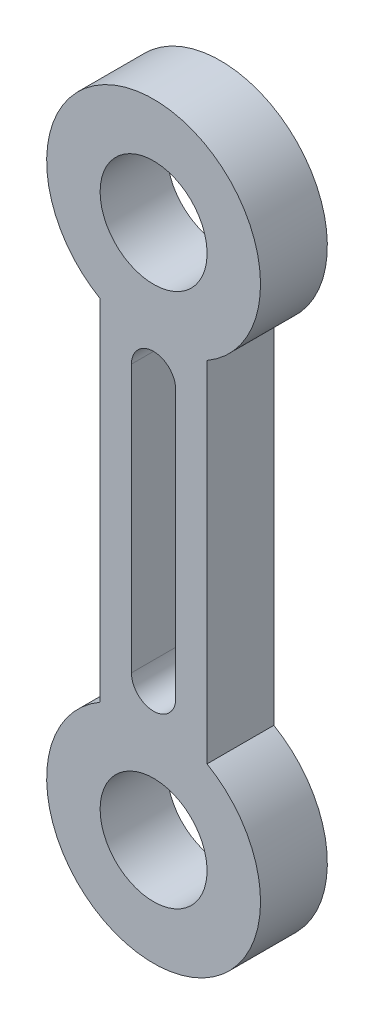
ISO-10303-21;
HEADER;
FILE_DESCRIPTION(('STEP AP214'),'2;1');
FILE_NAME('part.step','',(''),(''),'','','');
FILE_SCHEMA(('AUTOMOTIVE_DESIGN { 1 0 10303 214 1 1 1 1 }'));
ENDSEC;
DATA;
#1=APPLICATION_CONTEXT('core data for automotive mechanical design processes');
#2=APPLICATION_PROTOCOL_DEFINITION('international standard','automotive_design',2000,#1);
#3=PRODUCT_CONTEXT('',#1,'mechanical');
#4=PRODUCT('Part','Part','',(#3));
#5=PRODUCT_RELATED_PRODUCT_CATEGORY('part','',(#4));
#6=PRODUCT_DEFINITION_FORMATION('','',#4);
#7=PRODUCT_DEFINITION_CONTEXT('part definition',#1,'design');
#8=PRODUCT_DEFINITION('design','',#6,#7);
#9=PRODUCT_DEFINITION_SHAPE('','',#8);
#10=(LENGTH_UNIT() NAMED_UNIT(*) SI_UNIT(.MILLI.,.METRE.));
#11=(NAMED_UNIT(*) PLANE_ANGLE_UNIT() SI_UNIT($,.RADIAN.));
#12=(NAMED_UNIT(*) SI_UNIT($,.STERADIAN.) SOLID_ANGLE_UNIT());
#13=UNCERTAINTY_MEASURE_WITH_UNIT(LENGTH_MEASURE(1.E-05),#10,'distance_accuracy_value','');
#14=(GEOMETRIC_REPRESENTATION_CONTEXT(3) GLOBAL_UNCERTAINTY_ASSIGNED_CONTEXT((#13)) GLOBAL_UNIT_ASSIGNED_CONTEXT((#10,
#11,#12)) REPRESENTATION_CONTEXT('',''));
#15=CARTESIAN_POINT('',(0.,0.,0.));
#16=DIRECTION('',(0.,0.,1.));
#17=DIRECTION('',(1.,0.,0.));
#18=AXIS2_PLACEMENT_3D('',#15,#16,#17);
#19=CARTESIAN_POINT('',(0.,0.,5.));
#20=DIRECTION('',(0.,0.,-1.));
#21=DIRECTION('',(-1.,0.,0.));
#22=AXIS2_PLACEMENT_3D('',#19,#20,#21);
#23=CYLINDRICAL_SURFACE('',#22,8.);
#24=CARTESIAN_POINT('',(0.,0.,0.));
#25=DIRECTION('',(0.,0.,1.));
#26=DIRECTION('',(1.,0.,0.));
#27=AXIS2_PLACEMENT_3D('',#24,#25,#26);
#28=CIRCLE('',#27,8.);
#29=CARTESIAN_POINT('',(4.,-6.92820323027551,0.));
#30=VERTEX_POINT('',#29);
#31=CARTESIAN_POINT('',(-4.,-6.92820323027551,0.));
#32=VERTEX_POINT('',#31);
#33=EDGE_CURVE('E142',#30,#32,#28,.T.);
#34=ORIENTED_EDGE('',*,*,#33,.T.);
#35=DIRECTION('',(0.,0.,-1.));
#36=VECTOR('',#35,1.);
#37=CARTESIAN_POINT('',(-4.,-6.92820323027551,5.));
#38=LINE('',#37,#36);
#39=CARTESIAN_POINT('',(-4.,-6.92820323027551,5.));
#40=VERTEX_POINT('',#39);
#41=EDGE_CURVE('E11',#40,#32,#38,.T.);
#42=ORIENTED_EDGE('',*,*,#41,.F.);
#43=CARTESIAN_POINT('',(0.,0.,5.));
#44=DIRECTION('',(0.,0.,1.));
#45=DIRECTION('',(1.,0.,0.));
#46=AXIS2_PLACEMENT_3D('',#43,#44,#45);
#47=CIRCLE('',#46,8.);
#48=CARTESIAN_POINT('',(4.,-6.92820323027551,5.));
#49=VERTEX_POINT('',#48);
#50=EDGE_CURVE('E151',#49,#40,#47,.T.);
#51=ORIENTED_EDGE('',*,*,#50,.F.);
#52=DIRECTION('',(0.,0.,-1.));
#53=VECTOR('',#52,1.);
#54=CARTESIAN_POINT('',(4.,-6.92820323027551,5.));
#55=LINE('',#54,#53);
#56=EDGE_CURVE('E162',#49,#30,#55,.T.);
#57=ORIENTED_EDGE('',*,*,#56,.T.);
#58=EDGE_LOOP('',(#34,#42,#51,#57));
#59=FACE_BOUND('',#58,.T.);
#60=ADVANCED_FACE('F38',(#59),#23,.T.);
#61=CARTESIAN_POINT('',(-4.,0.,5.));
#62=DIRECTION('',(1.,0.,0.));
#63=DIRECTION('',(0.,1.,0.));
#64=AXIS2_PLACEMENT_3D('',#61,#62,#63);
#65=PLANE('',#64);
#66=DIRECTION('',(0.,-1.,0.));
#67=VECTOR('',#66,1.);
#68=CARTESIAN_POINT('',(-4.,0.,0.));
#69=LINE('',#68,#67);
#70=CARTESIAN_POINT('',(-4.,-33.0717967697245,0.));
#71=VERTEX_POINT('',#70);
#72=EDGE_CURVE('E165',#32,#71,#69,.T.);
#73=ORIENTED_EDGE('',*,*,#72,.T.);
#74=DIRECTION('',(0.,0.,-1.));
#75=VECTOR('',#74,1.);
#76=CARTESIAN_POINT('',(-4.,-33.0717967697245,5.));
#77=LINE('',#76,#75);
#78=CARTESIAN_POINT('',(-4.,-33.0717967697245,5.));
#79=VERTEX_POINT('',#78);
#80=EDGE_CURVE('E45',#79,#71,#77,.T.);
#81=ORIENTED_EDGE('',*,*,#80,.F.);
#82=DIRECTION('',(0.,-1.,0.));
#83=VECTOR('',#82,1.);
#84=CARTESIAN_POINT('',(-4.,0.,5.));
#85=LINE('',#84,#83);
#86=EDGE_CURVE('E154',#40,#79,#85,.T.);
#87=ORIENTED_EDGE('',*,*,#86,.F.);
#88=ORIENTED_EDGE('',*,*,#41,.T.);
#89=EDGE_LOOP('',(#73,#81,#87,#88));
#90=FACE_BOUND('',#89,.T.);
#91=ADVANCED_FACE('F192',(#90),#65,.F.);
#92=CARTESIAN_POINT('',(0.,-40.,5.));
#93=DIRECTION('',(0.,0.,-1.));
#94=DIRECTION('',(-1.,0.,0.));
#95=AXIS2_PLACEMENT_3D('',#92,#93,#94);
#96=CYLINDRICAL_SURFACE('',#95,8.);
#97=CARTESIAN_POINT('',(0.,-40.,0.));
#98=DIRECTION('',(0.,0.,1.));
#99=DIRECTION('',(1.,0.,0.));
#100=AXIS2_PLACEMENT_3D('',#97,#98,#99);
#101=CIRCLE('',#100,8.);
#102=CARTESIAN_POINT('',(4.,-33.0717967697245,0.));
#103=VERTEX_POINT('',#102);
#104=EDGE_CURVE('E167',#71,#103,#101,.T.);
#105=ORIENTED_EDGE('',*,*,#104,.T.);
#106=DIRECTION('',(0.,0.,-1.));
#107=VECTOR('',#106,1.);
#108=CARTESIAN_POINT('',(4.,-33.0717967697245,5.));
#109=LINE('',#108,#107);
#110=CARTESIAN_POINT('',(4.,-33.0717967697245,5.));
#111=VERTEX_POINT('',#110);
#112=EDGE_CURVE('E173',#111,#103,#109,.T.);
#113=ORIENTED_EDGE('',*,*,#112,.F.);
#114=CARTESIAN_POINT('',(0.,-40.,5.));
#115=DIRECTION('',(0.,0.,1.));
#116=DIRECTION('',(1.,0.,0.));
#117=AXIS2_PLACEMENT_3D('',#114,#115,#116);
#118=CIRCLE('',#117,8.);
#119=EDGE_CURVE('E157',#79,#111,#118,.T.);
#120=ORIENTED_EDGE('',*,*,#119,.F.);
#121=ORIENTED_EDGE('',*,*,#80,.T.);
#122=EDGE_LOOP('',(#105,#113,#120,#121));
#123=FACE_BOUND('',#122,.T.);
#124=ADVANCED_FACE('F179',(#123),#96,.T.);
#125=CARTESIAN_POINT('',(4.,0.,5.));
#126=DIRECTION('',(1.,0.,0.));
#127=DIRECTION('',(0.,1.,0.));
#128=AXIS2_PLACEMENT_3D('',#125,#126,#127);
#129=PLANE('',#128);
#130=DIRECTION('',(0.,-1.,0.));
#131=VECTOR('',#130,1.);
#132=CARTESIAN_POINT('',(4.,0.,0.));
#133=LINE('',#132,#131);
#134=EDGE_CURVE('E155',#30,#103,#133,.T.);
#135=ORIENTED_EDGE('',*,*,#134,.F.);
#136=ORIENTED_EDGE('',*,*,#56,.F.);
#137=DIRECTION('',(0.,-1.,0.));
#138=VECTOR('',#137,1.);
#139=CARTESIAN_POINT('',(4.,0.,5.));
#140=LINE('',#139,#138);
#141=EDGE_CURVE('E159',#49,#111,#140,.T.);
#142=ORIENTED_EDGE('',*,*,#141,.T.);
#143=ORIENTED_EDGE('',*,*,#112,.T.);
#144=EDGE_LOOP('',(#135,#136,#142,#143));
#145=FACE_BOUND('',#144,.T.);
#146=ADVANCED_FACE('F187',(#145),#129,.T.);
#147=CARTESIAN_POINT('',(0.,0.,5.));
#148=DIRECTION('',(0.,0.,1.));
#149=DIRECTION('',(1.,0.,0.));
#150=AXIS2_PLACEMENT_3D('',#147,#148,#149);
#151=PLANE('',#150);
#152=CARTESIAN_POINT('',(0.,-10.,5.));
#153=DIRECTION('',(0.,0.,-1.));
#154=DIRECTION('',(-1.,0.,0.));
#155=AXIS2_PLACEMENT_3D('',#152,#153,#154);
#156=CIRCLE('',#155,1.65795532848356);
#157=CARTESIAN_POINT('',(-1.65795532848356,-10.,5.));
#158=VERTEX_POINT('',#157);
#159=CARTESIAN_POINT('',(1.65795532848356,-10.,5.));
#160=VERTEX_POINT('',#159);
#161=EDGE_CURVE('E104',#158,#160,#156,.T.);
#162=ORIENTED_EDGE('',*,*,#161,.T.);
#163=DIRECTION('',(0.,-1.,0.));
#164=VECTOR('',#163,1.);
#165=CARTESIAN_POINT('',(1.65795532848356,-10.,5.));
#166=LINE('',#165,#164);
#167=CARTESIAN_POINT('',(1.65795532848356,-30.,5.));
#168=VERTEX_POINT('',#167);
#169=EDGE_CURVE('E113',#160,#168,#166,.T.);
#170=ORIENTED_EDGE('',*,*,#169,.T.);
#171=CARTESIAN_POINT('',(0.,-30.,5.));
#172=DIRECTION('',(0.,0.,-1.));
#173=DIRECTION('',(-1.,0.,0.));
#174=AXIS2_PLACEMENT_3D('',#171,#172,#173);
#175=CIRCLE('',#174,1.65795532848356);
#176=CARTESIAN_POINT('',(-1.65795532848356,-30.,5.));
#177=VERTEX_POINT('',#176);
#178=EDGE_CURVE('E52',#168,#177,#175,.T.);
#179=ORIENTED_EDGE('',*,*,#178,.T.);
#180=DIRECTION('',(0.,1.,0.));
#181=VECTOR('',#180,1.);
#182=CARTESIAN_POINT('',(-1.65795532848356,-10.,5.));
#183=LINE('',#182,#181);
#184=EDGE_CURVE('E110',#177,#158,#183,.T.);
#185=ORIENTED_EDGE('',*,*,#184,.T.);
#186=EDGE_LOOP('',(#162,#170,#179,#185));
#187=FACE_BOUND('',#186,.T.);
#188=CARTESIAN_POINT('',(0.,0.,5.));
#189=DIRECTION('',(0.,0.,-1.));
#190=DIRECTION('',(-1.,0.,0.));
#191=AXIS2_PLACEMENT_3D('',#188,#189,#190);
#192=CIRCLE('',#191,4.);
#193=CARTESIAN_POINT('',(-4.,0.,5.));
#194=VERTEX_POINT('',#193);
#195=EDGE_CURVE('E139',#194,#194,#192,.T.);
#196=ORIENTED_EDGE('',*,*,#195,.T.);
#197=EDGE_LOOP('',(#196));
#198=FACE_BOUND('',#197,.T.);
#199=CARTESIAN_POINT('',(0.,-40.,5.));
#200=DIRECTION('',(0.,0.,-1.));
#201=DIRECTION('',(-1.,0.,0.));
#202=AXIS2_PLACEMENT_3D('',#199,#200,#201);
#203=CIRCLE('',#202,4.);
#204=CARTESIAN_POINT('',(-4.,-40.,5.));
#205=VERTEX_POINT('',#204);
#206=EDGE_CURVE('E146',#205,#205,#203,.T.);
#207=ORIENTED_EDGE('',*,*,#206,.T.);
#208=EDGE_LOOP('',(#207));
#209=FACE_BOUND('',#208,.T.);
#210=ORIENTED_EDGE('',*,*,#50,.T.);
#211=ORIENTED_EDGE('',*,*,#86,.T.);
#212=ORIENTED_EDGE('',*,*,#119,.T.);
#213=ORIENTED_EDGE('',*,*,#141,.F.);
#214=EDGE_LOOP('',(#210,#211,#212,#213));
#215=FACE_BOUND('',#214,.T.);
#216=ADVANCED_FACE('F117',(#187,#198,#209,#215),#151,.T.);
#217=CARTESIAN_POINT('',(0.,0.,0.));
#218=DIRECTION('',(0.,0.,1.));
#219=DIRECTION('',(1.,0.,0.));
#220=AXIS2_PLACEMENT_3D('',#217,#218,#219);
#221=PLANE('',#220);
#222=DIRECTION('',(0.,-1.,0.));
#223=VECTOR('',#222,1.);
#224=CARTESIAN_POINT('',(1.65795532848356,-10.,0.));
#225=LINE('',#224,#223);
#226=CARTESIAN_POINT('',(1.65795532848356,-10.,0.));
#227=VERTEX_POINT('',#226);
#228=CARTESIAN_POINT('',(1.65795532848356,-30.,0.));
#229=VERTEX_POINT('',#228);
#230=EDGE_CURVE('E129',#227,#229,#225,.T.);
#231=ORIENTED_EDGE('',*,*,#230,.F.);
#232=CARTESIAN_POINT('',(0.,-10.,0.));
#233=DIRECTION('',(0.,0.,-1.));
#234=DIRECTION('',(-1.,0.,0.));
#235=AXIS2_PLACEMENT_3D('',#232,#233,#234);
#236=CIRCLE('',#235,1.65795532848356);
#237=CARTESIAN_POINT('',(-1.65795532848356,-10.,0.));
#238=VERTEX_POINT('',#237);
#239=EDGE_CURVE('E60',#238,#227,#236,.T.);
#240=ORIENTED_EDGE('',*,*,#239,.F.);
#241=DIRECTION('',(0.,1.,0.));
#242=VECTOR('',#241,1.);
#243=CARTESIAN_POINT('',(-1.65795532848356,-10.,0.));
#244=LINE('',#243,#242);
#245=CARTESIAN_POINT('',(-1.65795532848356,-30.,0.));
#246=VERTEX_POINT('',#245);
#247=EDGE_CURVE('E120',#246,#238,#244,.T.);
#248=ORIENTED_EDGE('',*,*,#247,.F.);
#249=CARTESIAN_POINT('',(0.,-30.,0.));
#250=DIRECTION('',(0.,0.,-1.));
#251=DIRECTION('',(-1.,0.,0.));
#252=AXIS2_PLACEMENT_3D('',#249,#250,#251);
#253=CIRCLE('',#252,1.65795532848356);
#254=EDGE_CURVE('E123',#229,#246,#253,.T.);
#255=ORIENTED_EDGE('',*,*,#254,.F.);
#256=EDGE_LOOP('',(#231,#240,#248,#255));
#257=FACE_BOUND('',#256,.T.);
#258=CARTESIAN_POINT('',(0.,0.,0.));
#259=DIRECTION('',(0.,0.,-1.));
#260=DIRECTION('',(-1.,0.,0.));
#261=AXIS2_PLACEMENT_3D('',#258,#259,#260);
#262=CIRCLE('',#261,4.);
#263=CARTESIAN_POINT('',(-4.,0.,0.));
#264=VERTEX_POINT('',#263);
#265=EDGE_CURVE('E143',#264,#264,#262,.T.);
#266=ORIENTED_EDGE('',*,*,#265,.F.);
#267=EDGE_LOOP('',(#266));
#268=FACE_BOUND('',#267,.T.);
#269=CARTESIAN_POINT('',(0.,-40.,0.));
#270=DIRECTION('',(0.,0.,-1.));
#271=DIRECTION('',(-1.,0.,0.));
#272=AXIS2_PLACEMENT_3D('',#269,#270,#271);
#273=CIRCLE('',#272,4.);
#274=CARTESIAN_POINT('',(-4.,-40.,0.));
#275=VERTEX_POINT('',#274);
#276=EDGE_CURVE('E135',#275,#275,#273,.T.);
#277=ORIENTED_EDGE('',*,*,#276,.F.);
#278=EDGE_LOOP('',(#277));
#279=FACE_BOUND('',#278,.T.);
#280=ORIENTED_EDGE('',*,*,#33,.F.);
#281=ORIENTED_EDGE('',*,*,#134,.T.);
#282=ORIENTED_EDGE('',*,*,#104,.F.);
#283=ORIENTED_EDGE('',*,*,#72,.F.);
#284=EDGE_LOOP('',(#280,#281,#282,#283));
#285=FACE_BOUND('',#284,.T.);
#286=ADVANCED_FACE('F184',(#257,#268,#279,#285),#221,.F.);
#287=CARTESIAN_POINT('',(0.,-40.,5.));
#288=DIRECTION('',(0.,0.,-1.));
#289=DIRECTION('',(-1.,0.,0.));
#290=AXIS2_PLACEMENT_3D('',#287,#288,#289);
#291=CYLINDRICAL_SURFACE('',#290,4.);
#292=ORIENTED_EDGE('',*,*,#206,.F.);
#293=EDGE_LOOP('',(#292));
#294=FACE_BOUND('',#293,.T.);
#295=ORIENTED_EDGE('',*,*,#276,.T.);
#296=EDGE_LOOP('',(#295));
#297=FACE_BOUND('',#296,.T.);
#298=ADVANCED_FACE('F207',(#294,#297),#291,.F.);
#299=CARTESIAN_POINT('',(0.,0.,5.));
#300=DIRECTION('',(0.,0.,-1.));
#301=DIRECTION('',(-1.,0.,0.));
#302=AXIS2_PLACEMENT_3D('',#299,#300,#301);
#303=CYLINDRICAL_SURFACE('',#302,4.);
#304=ORIENTED_EDGE('',*,*,#195,.F.);
#305=EDGE_LOOP('',(#304));
#306=FACE_BOUND('',#305,.T.);
#307=ORIENTED_EDGE('',*,*,#265,.T.);
#308=EDGE_LOOP('',(#307));
#309=FACE_BOUND('',#308,.T.);
#310=ADVANCED_FACE('F213',(#306,#309),#303,.F.);
#311=CARTESIAN_POINT('',(0.,-10.,5.));
#312=DIRECTION('',(0.,0.,-1.));
#313=DIRECTION('',(-1.,0.,0.));
#314=AXIS2_PLACEMENT_3D('',#311,#312,#313);
#315=CYLINDRICAL_SURFACE('',#314,1.65795532848356);
#316=ORIENTED_EDGE('',*,*,#239,.T.);
#317=DIRECTION('',(0.,0.,-1.));
#318=VECTOR('',#317,1.);
#319=CARTESIAN_POINT('',(1.65795532848356,-10.,5.));
#320=LINE('',#319,#318);
#321=EDGE_CURVE('E100',#160,#227,#320,.T.);
#322=ORIENTED_EDGE('',*,*,#321,.F.);
#323=ORIENTED_EDGE('',*,*,#161,.F.);
#324=DIRECTION('',(0.,0.,-1.));
#325=VECTOR('',#324,1.);
#326=CARTESIAN_POINT('',(-1.65795532848356,-10.,5.));
#327=LINE('',#326,#325);
#328=EDGE_CURVE('E133',#158,#238,#327,.T.);
#329=ORIENTED_EDGE('',*,*,#328,.T.);
#330=EDGE_LOOP('',(#316,#322,#323,#329));
#331=FACE_BOUND('',#330,.T.);
#332=ADVANCED_FACE('F102',(#331),#315,.F.);
#333=CARTESIAN_POINT('',(-1.65795532848356,-10.,5.));
#334=DIRECTION('',(-1.,0.,0.));
#335=DIRECTION('',(0.,-1.,0.));
#336=AXIS2_PLACEMENT_3D('',#333,#334,#335);
#337=PLANE('',#336);
#338=ORIENTED_EDGE('',*,*,#247,.T.);
#339=ORIENTED_EDGE('',*,*,#328,.F.);
#340=ORIENTED_EDGE('',*,*,#184,.F.);
#341=DIRECTION('',(0.,0.,-1.));
#342=VECTOR('',#341,1.);
#343=CARTESIAN_POINT('',(-1.65795532848356,-30.,5.));
#344=LINE('',#343,#342);
#345=EDGE_CURVE('E136',#177,#246,#344,.T.);
#346=ORIENTED_EDGE('',*,*,#345,.T.);
#347=EDGE_LOOP('',(#338,#339,#340,#346));
#348=FACE_BOUND('',#347,.T.);
#349=ADVANCED_FACE('F220',(#348),#337,.F.);
#350=CARTESIAN_POINT('',(0.,-30.,5.));
#351=DIRECTION('',(0.,0.,-1.));
#352=DIRECTION('',(-1.,0.,0.));
#353=AXIS2_PLACEMENT_3D('',#350,#351,#352);
#354=CYLINDRICAL_SURFACE('',#353,1.65795532848356);
#355=ORIENTED_EDGE('',*,*,#254,.T.);
#356=ORIENTED_EDGE('',*,*,#345,.F.);
#357=ORIENTED_EDGE('',*,*,#178,.F.);
#358=DIRECTION('',(0.,0.,-1.));
#359=VECTOR('',#358,1.);
#360=CARTESIAN_POINT('',(1.65795532848356,-30.,5.));
#361=LINE('',#360,#359);
#362=EDGE_CURVE('E109',#168,#229,#361,.T.);
#363=ORIENTED_EDGE('',*,*,#362,.T.);
#364=EDGE_LOOP('',(#355,#356,#357,#363));
#365=FACE_BOUND('',#364,.T.);
#366=ADVANCED_FACE('F223',(#365),#354,.F.);
#367=CARTESIAN_POINT('',(1.65795532848356,-10.,5.));
#368=DIRECTION('',(1.,0.,0.));
#369=DIRECTION('',(0.,1.,0.));
#370=AXIS2_PLACEMENT_3D('',#367,#368,#369);
#371=PLANE('',#370);
#372=ORIENTED_EDGE('',*,*,#230,.T.);
#373=ORIENTED_EDGE('',*,*,#362,.F.);
#374=ORIENTED_EDGE('',*,*,#169,.F.);
#375=ORIENTED_EDGE('',*,*,#321,.T.);
#376=EDGE_LOOP('',(#372,#373,#374,#375));
#377=FACE_BOUND('',#376,.T.);
#378=ADVANCED_FACE('F114',(#377),#371,.F.);
#379=CLOSED_SHELL('',(#60,#91,#124,#146,#216,#286,#298,#310,#332,#349,#366,#378));
#380=MANIFOLD_SOLID_BREP('B2',#379);
#381=ADVANCED_BREP_SHAPE_REPRESENTATION('',(#18,#380),#14);
#382=SHAPE_DEFINITION_REPRESENTATION(#9,#381);
ENDSEC;
END-ISO-10303-21;
